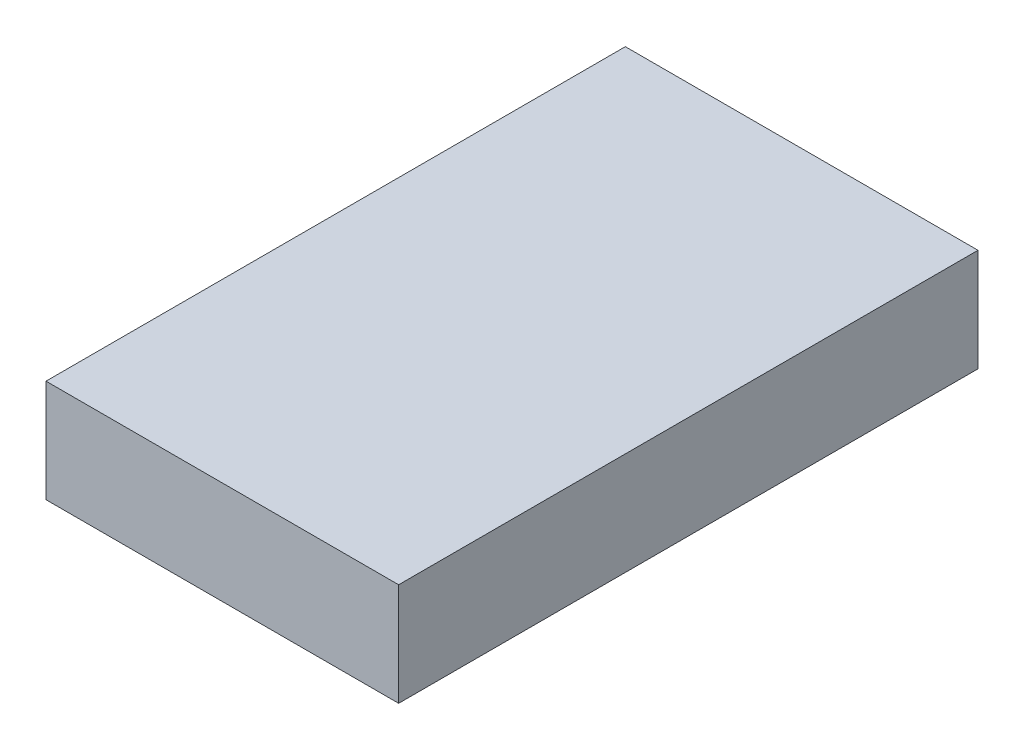
ISO-10303-21;
HEADER;
FILE_DESCRIPTION(('STEP AP214'),'2;1');
FILE_NAME('part.step','',(''),(''),'','','');
FILE_SCHEMA(('AUTOMOTIVE_DESIGN { 1 0 10303 214 1 1 1 1 }'));
ENDSEC;
DATA;
#1=APPLICATION_CONTEXT('core data for automotive mechanical design processes');
#2=APPLICATION_PROTOCOL_DEFINITION('international standard','automotive_design',2000,#1);
#3=PRODUCT_CONTEXT('',#1,'mechanical');
#4=PRODUCT('Part','Part','',(#3));
#5=PRODUCT_RELATED_PRODUCT_CATEGORY('part','',(#4));
#6=PRODUCT_DEFINITION_FORMATION('','',#4);
#7=PRODUCT_DEFINITION_CONTEXT('part definition',#1,'design');
#8=PRODUCT_DEFINITION('design','',#6,#7);
#9=PRODUCT_DEFINITION_SHAPE('','',#8);
#10=(LENGTH_UNIT() NAMED_UNIT(*) SI_UNIT(.MILLI.,.METRE.));
#11=(NAMED_UNIT(*) PLANE_ANGLE_UNIT() SI_UNIT($,.RADIAN.));
#12=(NAMED_UNIT(*) SI_UNIT($,.STERADIAN.) SOLID_ANGLE_UNIT());
#13=UNCERTAINTY_MEASURE_WITH_UNIT(LENGTH_MEASURE(1.E-05),#10,'distance_accuracy_value','');
#14=(GEOMETRIC_REPRESENTATION_CONTEXT(3) GLOBAL_UNCERTAINTY_ASSIGNED_CONTEXT((#13)) GLOBAL_UNIT_ASSIGNED_CONTEXT((#10,
#11,#12)) REPRESENTATION_CONTEXT('',''));
#15=CARTESIAN_POINT('',(0.,0.,0.));
#16=DIRECTION('',(0.,0.,1.));
#17=DIRECTION('',(1.,0.,0.));
#18=AXIS2_PLACEMENT_3D('',#15,#16,#17);
#19=CARTESIAN_POINT('',(9.1,5.3,14.95));
#20=DIRECTION('',(-1.,0.,0.));
#21=DIRECTION('',(0.,0.,1.));
#22=AXIS2_PLACEMENT_3D('',#19,#20,#21);
#23=PLANE('',#22);
#24=DIRECTION('',(0.,0.,-1.));
#25=VECTOR('',#24,1.);
#26=CARTESIAN_POINT('',(9.1,0.,14.95));
#27=LINE('',#26,#25);
#28=CARTESIAN_POINT('',(9.1,0.,14.95));
#29=VERTEX_POINT('',#28);
#30=CARTESIAN_POINT('',(9.1,0.,-14.95));
#31=VERTEX_POINT('',#30);
#32=EDGE_CURVE('E103',#29,#31,#27,.T.);
#33=ORIENTED_EDGE('',*,*,#32,.T.);
#34=DIRECTION('',(0.,-1.,0.));
#35=VECTOR('',#34,1.);
#36=CARTESIAN_POINT('',(9.1,5.3,-14.95));
#37=LINE('',#36,#35);
#38=CARTESIAN_POINT('',(9.1,5.3,-14.95));
#39=VERTEX_POINT('',#38);
#40=EDGE_CURVE('E11',#39,#31,#37,.T.);
#41=ORIENTED_EDGE('',*,*,#40,.F.);
#42=DIRECTION('',(0.,0.,-1.));
#43=VECTOR('',#42,1.);
#44=CARTESIAN_POINT('',(9.1,5.3,14.95));
#45=LINE('',#44,#43);
#46=CARTESIAN_POINT('',(9.1,5.3,14.95));
#47=VERTEX_POINT('',#46);
#48=EDGE_CURVE('E91',#47,#39,#45,.T.);
#49=ORIENTED_EDGE('',*,*,#48,.F.);
#50=DIRECTION('',(0.,-1.,0.));
#51=VECTOR('',#50,1.);
#52=CARTESIAN_POINT('',(9.1,5.3,14.95));
#53=LINE('',#52,#51);
#54=EDGE_CURVE('E99',#47,#29,#53,.T.);
#55=ORIENTED_EDGE('',*,*,#54,.T.);
#56=EDGE_LOOP('',(#33,#41,#49,#55));
#57=FACE_BOUND('',#56,.T.);
#58=ADVANCED_FACE('F40',(#57),#23,.F.);
#59=CARTESIAN_POINT('',(-9.1,5.3,-14.95));
#60=DIRECTION('',(0.,0.,1.));
#61=DIRECTION('',(1.,0.,0.));
#62=AXIS2_PLACEMENT_3D('',#59,#60,#61);
#63=PLANE('',#62);
#64=DIRECTION('',(-1.,0.,0.));
#65=VECTOR('',#64,1.);
#66=CARTESIAN_POINT('',(-9.1,0.,-14.95));
#67=LINE('',#66,#65);
#68=CARTESIAN_POINT('',(-9.1,0.,-14.95));
#69=VERTEX_POINT('',#68);
#70=EDGE_CURVE('E95',#31,#69,#67,.T.);
#71=ORIENTED_EDGE('',*,*,#70,.T.);
#72=DIRECTION('',(0.,-1.,0.));
#73=VECTOR('',#72,1.);
#74=CARTESIAN_POINT('',(-9.1,5.3,-14.95));
#75=LINE('',#74,#73);
#76=CARTESIAN_POINT('',(-9.1,5.3,-14.95));
#77=VERTEX_POINT('',#76);
#78=EDGE_CURVE('E48',#77,#69,#75,.T.);
#79=ORIENTED_EDGE('',*,*,#78,.F.);
#80=DIRECTION('',(-1.,0.,0.));
#81=VECTOR('',#80,1.);
#82=CARTESIAN_POINT('',(-9.1,5.3,-14.95));
#83=LINE('',#82,#81);
#84=EDGE_CURVE('E86',#39,#77,#83,.T.);
#85=ORIENTED_EDGE('',*,*,#84,.F.);
#86=ORIENTED_EDGE('',*,*,#40,.T.);
#87=EDGE_LOOP('',(#71,#79,#85,#86));
#88=FACE_BOUND('',#87,.T.);
#89=ADVANCED_FACE('F94',(#88),#63,.F.);
#90=CARTESIAN_POINT('',(-9.1,5.3,14.95));
#91=DIRECTION('',(1.,0.,0.));
#92=DIRECTION('',(0.,0.,-1.));
#93=AXIS2_PLACEMENT_3D('',#90,#91,#92);
#94=PLANE('',#93);
#95=DIRECTION('',(0.,0.,1.));
#96=VECTOR('',#95,1.);
#97=CARTESIAN_POINT('',(-9.1,0.,14.95));
#98=LINE('',#97,#96);
#99=CARTESIAN_POINT('',(-9.1,0.,14.95));
#100=VERTEX_POINT('',#99);
#101=EDGE_CURVE('E73',#69,#100,#98,.T.);
#102=ORIENTED_EDGE('',*,*,#101,.T.);
#103=DIRECTION('',(0.,-1.,0.));
#104=VECTOR('',#103,1.);
#105=CARTESIAN_POINT('',(-9.1,5.3,14.95));
#106=LINE('',#105,#104);
#107=CARTESIAN_POINT('',(-9.1,5.3,14.95));
#108=VERTEX_POINT('',#107);
#109=EDGE_CURVE('E96',#108,#100,#106,.T.);
#110=ORIENTED_EDGE('',*,*,#109,.F.);
#111=DIRECTION('',(0.,0.,1.));
#112=VECTOR('',#111,1.);
#113=CARTESIAN_POINT('',(-9.1,5.3,14.95));
#114=LINE('',#113,#112);
#115=EDGE_CURVE('E89',#77,#108,#114,.T.);
#116=ORIENTED_EDGE('',*,*,#115,.F.);
#117=ORIENTED_EDGE('',*,*,#78,.T.);
#118=EDGE_LOOP('',(#102,#110,#116,#117));
#119=FACE_BOUND('',#118,.T.);
#120=ADVANCED_FACE('F97',(#119),#94,.F.);
#121=CARTESIAN_POINT('',(-9.1,5.3,14.95));
#122=DIRECTION('',(0.,0.,-1.));
#123=DIRECTION('',(-1.,0.,0.));
#124=AXIS2_PLACEMENT_3D('',#121,#122,#123);
#125=PLANE('',#124);
#126=DIRECTION('',(1.,0.,0.));
#127=VECTOR('',#126,1.);
#128=CARTESIAN_POINT('',(-9.1,0.,14.95));
#129=LINE('',#128,#127);
#130=EDGE_CURVE('E79',#100,#29,#129,.T.);
#131=ORIENTED_EDGE('',*,*,#130,.T.);
#132=ORIENTED_EDGE('',*,*,#54,.F.);
#133=DIRECTION('',(1.,0.,0.));
#134=VECTOR('',#133,1.);
#135=CARTESIAN_POINT('',(-9.1,5.3,14.95));
#136=LINE('',#135,#134);
#137=EDGE_CURVE('E56',#108,#47,#136,.T.);
#138=ORIENTED_EDGE('',*,*,#137,.F.);
#139=ORIENTED_EDGE('',*,*,#109,.T.);
#140=EDGE_LOOP('',(#131,#132,#138,#139));
#141=FACE_BOUND('',#140,.T.);
#142=ADVANCED_FACE('F110',(#141),#125,.F.);
#143=CARTESIAN_POINT('',(0.,5.3,0.));
#144=DIRECTION('',(0.,-1.,0.));
#145=DIRECTION('',(0.,0.,-1.));
#146=AXIS2_PLACEMENT_3D('',#143,#144,#145);
#147=PLANE('',#146);
#148=ORIENTED_EDGE('',*,*,#48,.T.);
#149=ORIENTED_EDGE('',*,*,#84,.T.);
#150=ORIENTED_EDGE('',*,*,#115,.T.);
#151=ORIENTED_EDGE('',*,*,#137,.T.);
#152=EDGE_LOOP('',(#148,#149,#150,#151));
#153=FACE_BOUND('',#152,.T.);
#154=ADVANCED_FACE('F87',(#153),#147,.F.);
#155=CARTESIAN_POINT('',(0.,0.,0.));
#156=DIRECTION('',(0.,-1.,0.));
#157=DIRECTION('',(0.,0.,-1.));
#158=AXIS2_PLACEMENT_3D('',#155,#156,#157);
#159=PLANE('',#158);
#160=ORIENTED_EDGE('',*,*,#32,.F.);
#161=ORIENTED_EDGE('',*,*,#130,.F.);
#162=ORIENTED_EDGE('',*,*,#101,.F.);
#163=ORIENTED_EDGE('',*,*,#70,.F.);
#164=EDGE_LOOP('',(#160,#161,#162,#163));
#165=FACE_BOUND('',#164,.T.);
#166=ADVANCED_FACE('F113',(#165),#159,.T.);
#167=CLOSED_SHELL('',(#58,#89,#120,#142,#154,#166));
#168=MANIFOLD_SOLID_BREP('B2',#167);
#169=ADVANCED_BREP_SHAPE_REPRESENTATION('',(#18,#168),#14);
#170=SHAPE_DEFINITION_REPRESENTATION(#9,#169);
ENDSEC;
END-ISO-10303-21;
